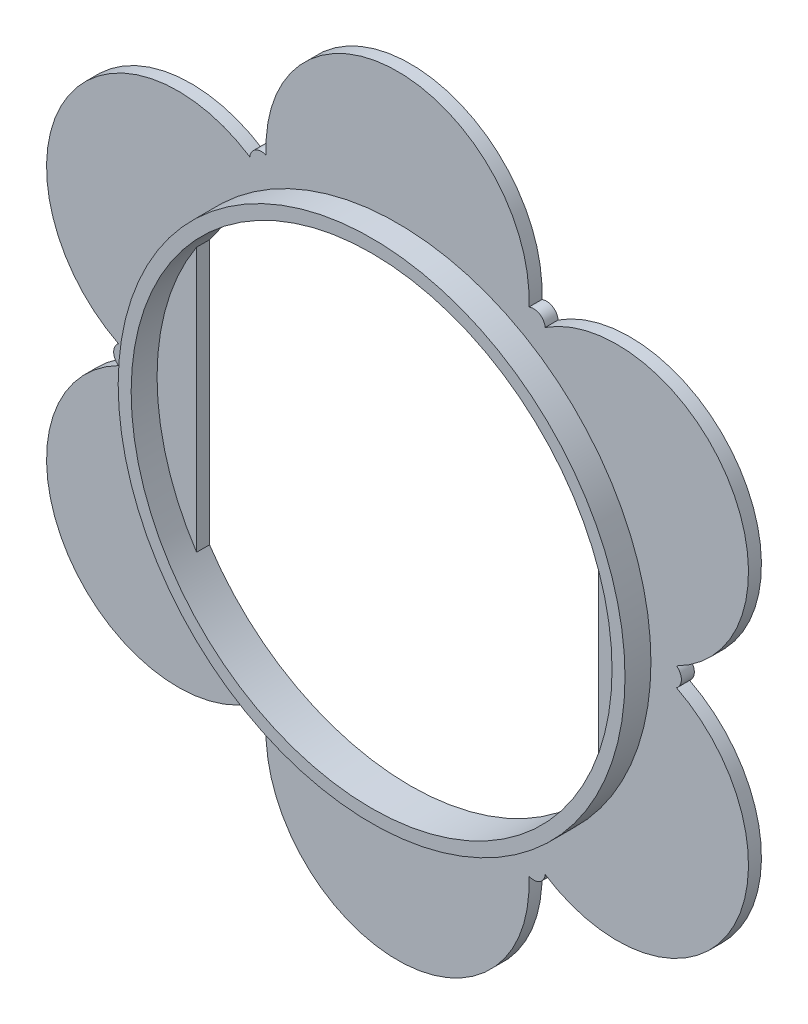
ISO-10303-21;
HEADER;
FILE_DESCRIPTION(('STEP AP214'),'2;1');
FILE_NAME('part.step','',(''),(''),'','','');
FILE_SCHEMA(('AUTOMOTIVE_DESIGN { 1 0 10303 214 1 1 1 1 }'));
ENDSEC;
DATA;
#1=APPLICATION_CONTEXT('core data for automotive mechanical design processes');
#2=APPLICATION_PROTOCOL_DEFINITION('international standard','automotive_design',2000,#1);
#3=PRODUCT_CONTEXT('',#1,'mechanical');
#4=PRODUCT('Part','Part','',(#3));
#5=PRODUCT_RELATED_PRODUCT_CATEGORY('part','',(#4));
#6=PRODUCT_DEFINITION_FORMATION('','',#4);
#7=PRODUCT_DEFINITION_CONTEXT('part definition',#1,'design');
#8=PRODUCT_DEFINITION('design','',#6,#7);
#9=PRODUCT_DEFINITION_SHAPE('','',#8);
#10=(LENGTH_UNIT() NAMED_UNIT(*) SI_UNIT(.MILLI.,.METRE.));
#11=(NAMED_UNIT(*) PLANE_ANGLE_UNIT() SI_UNIT($,.RADIAN.));
#12=(NAMED_UNIT(*) SI_UNIT($,.STERADIAN.) SOLID_ANGLE_UNIT());
#13=UNCERTAINTY_MEASURE_WITH_UNIT(LENGTH_MEASURE(1.E-05),#10,'distance_accuracy_value','');
#14=(GEOMETRIC_REPRESENTATION_CONTEXT(3) GLOBAL_UNCERTAINTY_ASSIGNED_CONTEXT((#13)) GLOBAL_UNIT_ASSIGNED_CONTEXT((#10,
#11,#12)) REPRESENTATION_CONTEXT('',''));
#15=CARTESIAN_POINT('',(0.,0.,0.));
#16=DIRECTION('',(0.,0.,1.));
#17=DIRECTION('',(1.,0.,0.));
#18=AXIS2_PLACEMENT_3D('',#15,#16,#17);
#19=CARTESIAN_POINT('',(-27.4296394046554,27.9595290821569,3.86907941255965));
#20=DIRECTION('',(0.,0.,1.));
#21=DIRECTION('',(1.,0.,0.));
#22=AXIS2_PLACEMENT_3D('',#19,#20,#21);
#23=PLANE('',#22);
#24=DIRECTION('',(0.,-1.,0.));
#25=VECTOR('',#24,1.);
#26=CARTESIAN_POINT('',(-31.,20.3816093574575,3.86907941255965));
#27=LINE('',#26,#25);
#28=CARTESIAN_POINT('',(-31.,20.3816093574575,3.86907941255965));
#29=VERTEX_POINT('',#28);
#30=CARTESIAN_POINT('',(-31.,-20.3816093574575,3.86907941255965));
#31=VERTEX_POINT('',#30);
#32=EDGE_CURVE('E243',#29,#31,#27,.T.);
#33=ORIENTED_EDGE('',*,*,#32,.F.);
#34=CARTESIAN_POINT('',(0.,0.,3.86907941255965));
#35=DIRECTION('',(0.,0.,1.));
#36=DIRECTION('',(1.,0.,0.));
#37=AXIS2_PLACEMENT_3D('',#34,#35,#36);
#38=CIRCLE('',#37,37.1);
#39=EDGE_CURVE('E48',#29,#31,#38,.T.);
#40=ORIENTED_EDGE('',*,*,#39,.T.);
#41=EDGE_LOOP('',(#33,#40));
#42=FACE_BOUND('',#41,.T.);
#43=ADVANCED_FACE('F39',(#42),#23,.T.);
#44=DIRECTION('',(0.,1.,0.));
#45=VECTOR('',#44,1.);
#46=CARTESIAN_POINT('',(30.9999999999999,20.3816093574575,3.86907941255965));
#47=LINE('',#46,#45);
#48=CARTESIAN_POINT('',(30.9999999999998,-20.3816093574579,3.86907941255965));
#49=VERTEX_POINT('',#48);
#50=CARTESIAN_POINT('',(30.9999999999999,20.3816093574575,3.86907941255965));
#51=VERTEX_POINT('',#50);
#52=EDGE_CURVE('E246',#49,#51,#47,.T.);
#53=ORIENTED_EDGE('',*,*,#52,.F.);
#54=EDGE_CURVE('E226',#49,#51,#38,.T.);
#55=ORIENTED_EDGE('',*,*,#54,.T.);
#56=EDGE_LOOP('',(#53,#55));
#57=FACE_BOUND('',#56,.T.);
#58=ADVANCED_FACE('F323',(#57),#23,.T.);
#59=CARTESIAN_POINT('',(0.,0.,3.86907941255965));
#60=DIRECTION('',(0.,0.,1.));
#61=DIRECTION('',(1.,0.,0.));
#62=AXIS2_PLACEMENT_3D('',#59,#60,#61);
#63=CIRCLE('',#62,39.1);
#64=CARTESIAN_POINT('',(39.1,0.,3.86907941255965));
#65=VERTEX_POINT('',#64);
#66=EDGE_CURVE('E11',#65,#65,#63,.T.);
#67=ORIENTED_EDGE('',*,*,#66,.F.);
#68=EDGE_LOOP('',(#67));
#69=FACE_BOUND('',#68,.T.);
#70=CARTESIAN_POINT('',(-20.9976855213396,36.3690581643134,3.86907941255965));
#71=DIRECTION('',(0.,0.,1.));
#72=DIRECTION('',(1.,0.,0.));
#73=AXIS2_PLACEMENT_3D('',#70,#71,#72);
#74=CIRCLE('',#73,1.80000000000002);
#75=CARTESIAN_POINT('',(-20.2604108869917,38.0111379777047,3.86907941255965));
#76=VERTEX_POINT('',#75);
#77=CARTESIAN_POINT('',(-22.7884056719519,36.5515995080985,3.86907941255965));
#78=VERTEX_POINT('',#77);
#79=EDGE_CURVE('E205',#76,#78,#74,.T.);
#80=ORIENTED_EDGE('',*,*,#79,.T.);
#81=CARTESIAN_POINT('',(-33.8615932879713,19.5500000000004,3.86907941255965));
#82=DIRECTION('',(0.,0.,1.));
#83=DIRECTION('',(1.,0.,0.));
#84=AXIS2_PLACEMENT_3D('',#81,#82,#83);
#85=CIRCLE('',#84,20.2896493270172);
#86=CARTESIAN_POINT('',(-43.0488165589436,1.45953846960726,3.86907941255965));
#87=VERTEX_POINT('',#86);
#88=EDGE_CURVE('E118',#78,#87,#85,.T.);
#89=ORIENTED_EDGE('',*,*,#88,.T.);
#90=CARTESIAN_POINT('',(-41.995371042679,4.33680868994202E-13,3.86907941255965));
#91=DIRECTION('',(0.,0.,1.));
#92=DIRECTION('',(1.,0.,0.));
#93=AXIS2_PLACEMENT_3D('',#90,#91,#92);
#94=CIRCLE('',#93,1.80000000000002);
#95=CARTESIAN_POINT('',(-43.0488165589436,-1.45953846960634,3.86907941255965));
#96=VERTEX_POINT('',#95);
#97=EDGE_CURVE('E268',#87,#96,#94,.T.);
#98=ORIENTED_EDGE('',*,*,#97,.T.);
#99=CARTESIAN_POINT('',(-33.8615932879717,-19.5499999999997,3.86907941255965));
#100=DIRECTION('',(0.,0.,1.));
#101=DIRECTION('',(1.,0.,0.));
#102=AXIS2_PLACEMENT_3D('',#99,#100,#101);
#103=CIRCLE('',#102,20.2896493270172);
#104=CARTESIAN_POINT('',(-22.7884056719522,-36.5515995080978,3.86907941255965));
#105=VERTEX_POINT('',#104);
#106=EDGE_CURVE('E272',#96,#105,#103,.T.);
#107=ORIENTED_EDGE('',*,*,#106,.T.);
#108=CARTESIAN_POINT('',(-20.9976855213398,-36.3690581643133,3.86907941255965));
#109=DIRECTION('',(0.,0.,1.));
#110=DIRECTION('',(1.,0.,0.));
#111=AXIS2_PLACEMENT_3D('',#108,#109,#110);
#112=CIRCLE('',#111,1.80000000000002);
#113=CARTESIAN_POINT('',(-20.2604108869917,-38.0111379777045,3.86907941255965));
#114=VERTEX_POINT('',#113);
#115=EDGE_CURVE('E271',#105,#114,#112,.T.);
#116=ORIENTED_EDGE('',*,*,#115,.T.);
#117=CARTESIAN_POINT('',(0.,-39.1,3.86907941255965));
#118=DIRECTION('',(0.,0.,1.));
#119=DIRECTION('',(1.,0.,0.));
#120=AXIS2_PLACEMENT_3D('',#117,#118,#119);
#121=CIRCLE('',#120,20.2896493270172);
#122=CARTESIAN_POINT('',(20.2604108869917,-38.0111379777047,3.86907941255965));
#123=VERTEX_POINT('',#122);
#124=EDGE_CURVE('E273',#114,#123,#121,.T.);
#125=ORIENTED_EDGE('',*,*,#124,.T.);
#126=CARTESIAN_POINT('',(20.9976855213396,-36.3690581643134,3.86907941255965));
#127=DIRECTION('',(0.,0.,1.));
#128=DIRECTION('',(1.,0.,0.));
#129=AXIS2_PLACEMENT_3D('',#126,#127,#128);
#130=CIRCLE('',#129,1.80000000000002);
#131=CARTESIAN_POINT('',(22.7884056719519,-36.5515995080982,3.86907941255965));
#132=VERTEX_POINT('',#131);
#133=EDGE_CURVE('E276',#123,#132,#130,.T.);
#134=ORIENTED_EDGE('',*,*,#133,.T.);
#135=CARTESIAN_POINT('',(33.8615932879715,-19.5500000000002,3.86907941255965));
#136=DIRECTION('',(0.,0.,1.));
#137=DIRECTION('',(1.,0.,0.));
#138=AXIS2_PLACEMENT_3D('',#135,#136,#137);
#139=CIRCLE('',#138,20.2896493270172);
#140=CARTESIAN_POINT('',(43.0488165589436,-1.45953846960694,3.86907941255965));
#141=VERTEX_POINT('',#140);
#142=EDGE_CURVE('E278',#132,#141,#139,.T.);
#143=ORIENTED_EDGE('',*,*,#142,.T.);
#144=CARTESIAN_POINT('',(41.995371042679,-1.35308431126191E-13,3.86907941255965));
#145=DIRECTION('',(0.,0.,1.));
#146=DIRECTION('',(1.,0.,0.));
#147=AXIS2_PLACEMENT_3D('',#144,#145,#146);
#148=CIRCLE('',#147,1.80000000000001);
#149=CARTESIAN_POINT('',(43.0488165589436,1.45953846960665,3.86907941255965));
#150=VERTEX_POINT('',#149);
#151=EDGE_CURVE('E152',#141,#150,#148,.T.);
#152=ORIENTED_EDGE('',*,*,#151,.T.);
#153=CARTESIAN_POINT('',(33.8615932879716,19.5499999999999,3.86907941255965));
#154=DIRECTION('',(0.,0.,1.));
#155=DIRECTION('',(1.,0.,0.));
#156=AXIS2_PLACEMENT_3D('',#153,#154,#155);
#157=CIRCLE('',#156,20.2896493270172);
#158=CARTESIAN_POINT('',(22.788405671952,36.5515995080979,3.86907941255965));
#159=VERTEX_POINT('',#158);
#160=EDGE_CURVE('E146',#150,#159,#157,.T.);
#161=ORIENTED_EDGE('',*,*,#160,.T.);
#162=CARTESIAN_POINT('',(20.9976855213395,36.3690581643134,3.86907941255965));
#163=DIRECTION('',(0.,0.,1.));
#164=DIRECTION('',(1.,0.,0.));
#165=AXIS2_PLACEMENT_3D('',#162,#163,#164);
#166=CIRCLE('',#165,1.80000000000001);
#167=CARTESIAN_POINT('',(20.2604108869917,38.0111379777047,3.86907941255965));
#168=VERTEX_POINT('',#167);
#169=EDGE_CURVE('E151',#159,#168,#166,.T.);
#170=ORIENTED_EDGE('',*,*,#169,.T.);
#171=CARTESIAN_POINT('',(0.,39.1,3.86907941255965));
#172=DIRECTION('',(0.,0.,1.));
#173=DIRECTION('',(1.,0.,0.));
#174=AXIS2_PLACEMENT_3D('',#171,#172,#173);
#175=CIRCLE('',#174,20.2896493270172);
#176=EDGE_CURVE('E62',#168,#76,#175,.T.);
#177=ORIENTED_EDGE('',*,*,#176,.T.);
#178=EDGE_LOOP('',(#80,#89,#98,#107,#116,#125,#134,#143,#152,#161,#170,#177));
#179=FACE_BOUND('',#178,.T.);
#180=ADVANCED_FACE('F148',(#69,#179),#23,.T.);
#181=CARTESIAN_POINT('',(-27.4296394046554,27.9595290821569,1.86907941255965));
#182=DIRECTION('',(0.,0.,1.));
#183=DIRECTION('',(1.,0.,0.));
#184=AXIS2_PLACEMENT_3D('',#181,#182,#183);
#185=PLANE('',#184);
#186=CARTESIAN_POINT('',(-20.9976855213396,36.3690581643134,1.86907941255965));
#187=DIRECTION('',(0.,0.,1.));
#188=DIRECTION('',(1.,0.,0.));
#189=AXIS2_PLACEMENT_3D('',#186,#187,#188);
#190=CIRCLE('',#189,1.80000000000002);
#191=CARTESIAN_POINT('',(-20.2604108869917,38.0111379777047,1.86907941255965));
#192=VERTEX_POINT('',#191);
#193=CARTESIAN_POINT('',(-22.7884056719519,36.5515995080985,1.86907941255965));
#194=VERTEX_POINT('',#193);
#195=EDGE_CURVE('E174',#192,#194,#190,.T.);
#196=ORIENTED_EDGE('',*,*,#195,.F.);
#197=CARTESIAN_POINT('',(0.,39.1,1.86907941255965));
#198=DIRECTION('',(0.,0.,1.));
#199=DIRECTION('',(1.,0.,0.));
#200=AXIS2_PLACEMENT_3D('',#197,#198,#199);
#201=CIRCLE('',#200,20.2896493270172);
#202=CARTESIAN_POINT('',(20.2604108869917,38.0111379777047,1.86907941255965));
#203=VERTEX_POINT('',#202);
#204=EDGE_CURVE('E109',#203,#192,#201,.T.);
#205=ORIENTED_EDGE('',*,*,#204,.F.);
#206=CARTESIAN_POINT('',(20.9976855213395,36.3690581643134,1.86907941255965));
#207=DIRECTION('',(0.,0.,1.));
#208=DIRECTION('',(1.,0.,0.));
#209=AXIS2_PLACEMENT_3D('',#206,#207,#208);
#210=CIRCLE('',#209,1.80000000000001);
#211=CARTESIAN_POINT('',(22.788405671952,36.5515995080979,1.86907941255965));
#212=VERTEX_POINT('',#211);
#213=EDGE_CURVE('E199',#212,#203,#210,.T.);
#214=ORIENTED_EDGE('',*,*,#213,.F.);
#215=CARTESIAN_POINT('',(33.8615932879716,19.5499999999999,1.86907941255965));
#216=DIRECTION('',(0.,0.,1.));
#217=DIRECTION('',(1.,0.,0.));
#218=AXIS2_PLACEMENT_3D('',#215,#216,#217);
#219=CIRCLE('',#218,20.2896493270172);
#220=CARTESIAN_POINT('',(43.0488165589436,1.45953846960665,1.86907941255965));
#221=VERTEX_POINT('',#220);
#222=EDGE_CURVE('E165',#221,#212,#219,.T.);
#223=ORIENTED_EDGE('',*,*,#222,.F.);
#224=CARTESIAN_POINT('',(41.995371042679,-1.35308431126191E-13,1.86907941255965));
#225=DIRECTION('',(0.,0.,1.));
#226=DIRECTION('',(1.,0.,0.));
#227=AXIS2_PLACEMENT_3D('',#224,#225,#226);
#228=CIRCLE('',#227,1.80000000000001);
#229=CARTESIAN_POINT('',(43.0488165589436,-1.45953846960694,1.86907941255965));
#230=VERTEX_POINT('',#229);
#231=EDGE_CURVE('E200',#230,#221,#228,.T.);
#232=ORIENTED_EDGE('',*,*,#231,.F.);
#233=CARTESIAN_POINT('',(33.8615932879715,-19.5500000000002,1.86907941255965));
#234=DIRECTION('',(0.,0.,1.));
#235=DIRECTION('',(1.,0.,0.));
#236=AXIS2_PLACEMENT_3D('',#233,#234,#235);
#237=CIRCLE('',#236,20.2896493270172);
#238=CARTESIAN_POINT('',(22.7884056719519,-36.5515995080982,1.86907941255965));
#239=VERTEX_POINT('',#238);
#240=EDGE_CURVE('E193',#239,#230,#237,.T.);
#241=ORIENTED_EDGE('',*,*,#240,.F.);
#242=CARTESIAN_POINT('',(20.9976855213396,-36.3690581643134,1.86907941255965));
#243=DIRECTION('',(0.,0.,1.));
#244=DIRECTION('',(1.,0.,0.));
#245=AXIS2_PLACEMENT_3D('',#242,#243,#244);
#246=CIRCLE('',#245,1.8);
#247=CARTESIAN_POINT('',(20.2604108869917,-38.0111379777047,1.86907941255965));
#248=VERTEX_POINT('',#247);
#249=EDGE_CURVE('E191',#248,#239,#246,.T.);
#250=ORIENTED_EDGE('',*,*,#249,.F.);
#251=CARTESIAN_POINT('',(0.,-39.1,1.86907941255965));
#252=DIRECTION('',(0.,0.,1.));
#253=DIRECTION('',(1.,0.,0.));
#254=AXIS2_PLACEMENT_3D('',#251,#252,#253);
#255=CIRCLE('',#254,20.2896493270172);
#256=CARTESIAN_POINT('',(-20.2604108869917,-38.0111379777045,1.86907941255965));
#257=VERTEX_POINT('',#256);
#258=EDGE_CURVE('E186',#257,#248,#255,.T.);
#259=ORIENTED_EDGE('',*,*,#258,.F.);
#260=CARTESIAN_POINT('',(-20.9976855213398,-36.3690581643133,1.86907941255965));
#261=DIRECTION('',(0.,0.,1.));
#262=DIRECTION('',(1.,0.,0.));
#263=AXIS2_PLACEMENT_3D('',#260,#261,#262);
#264=CIRCLE('',#263,1.80000000000001);
#265=CARTESIAN_POINT('',(-22.7884056719522,-36.5515995080978,1.86907941255965));
#266=VERTEX_POINT('',#265);
#267=EDGE_CURVE('E190',#266,#257,#264,.T.);
#268=ORIENTED_EDGE('',*,*,#267,.F.);
#269=CARTESIAN_POINT('',(-33.8615932879717,-19.5499999999997,1.86907941255965));
#270=DIRECTION('',(0.,0.,1.));
#271=DIRECTION('',(1.,0.,0.));
#272=AXIS2_PLACEMENT_3D('',#269,#270,#271);
#273=CIRCLE('',#272,20.2896493270172);
#274=CARTESIAN_POINT('',(-43.0488165589436,-1.45953846960634,1.86907941255965));
#275=VERTEX_POINT('',#274);
#276=EDGE_CURVE('E183',#275,#266,#273,.T.);
#277=ORIENTED_EDGE('',*,*,#276,.F.);
#278=CARTESIAN_POINT('',(-41.995371042679,4.33680868994202E-13,1.86907941255965));
#279=DIRECTION('',(0.,0.,1.));
#280=DIRECTION('',(1.,0.,0.));
#281=AXIS2_PLACEMENT_3D('',#278,#279,#280);
#282=CIRCLE('',#281,1.80000000000001);
#283=CARTESIAN_POINT('',(-43.0488165589436,1.45953846960726,1.86907941255965));
#284=VERTEX_POINT('',#283);
#285=EDGE_CURVE('E185',#284,#275,#282,.T.);
#286=ORIENTED_EDGE('',*,*,#285,.F.);
#287=CARTESIAN_POINT('',(-33.8615932879713,19.5500000000004,1.86907941255965));
#288=DIRECTION('',(0.,0.,1.));
#289=DIRECTION('',(1.,0.,0.));
#290=AXIS2_PLACEMENT_3D('',#287,#288,#289);
#291=CIRCLE('',#290,20.2896493270172);
#292=EDGE_CURVE('E178',#194,#284,#291,.T.);
#293=ORIENTED_EDGE('',*,*,#292,.F.);
#294=EDGE_LOOP('',(#196,#205,#214,#223,#232,#241,#250,#259,#268,#277,#286,#293));
#295=FACE_BOUND('',#294,.T.);
#296=CARTESIAN_POINT('',(0.,0.,1.86907941255965));
#297=DIRECTION('',(0.,0.,1.));
#298=DIRECTION('',(1.,0.,0.));
#299=AXIS2_PLACEMENT_3D('',#296,#297,#298);
#300=CIRCLE('',#299,37.0999999999999);
#301=CARTESIAN_POINT('',(30.9999999999999,20.3816093574575,1.86907941255965));
#302=VERTEX_POINT('',#301);
#303=CARTESIAN_POINT('',(-31.,20.3816093574575,1.86907941255965));
#304=VERTEX_POINT('',#303);
#305=EDGE_CURVE('E57',#302,#304,#300,.T.);
#306=ORIENTED_EDGE('',*,*,#305,.T.);
#307=DIRECTION('',(0.,-1.,0.));
#308=VECTOR('',#307,1.);
#309=CARTESIAN_POINT('',(-31.,20.3816093574575,1.86907941255965));
#310=LINE('',#309,#308);
#311=CARTESIAN_POINT('',(-30.9999999999999,-20.3816093574575,1.86907941255965));
#312=VERTEX_POINT('',#311);
#313=EDGE_CURVE('E252',#304,#312,#310,.T.);
#314=ORIENTED_EDGE('',*,*,#313,.T.);
#315=CARTESIAN_POINT('',(0.,0.,1.86907941255965));
#316=DIRECTION('',(0.,0.,1.));
#317=DIRECTION('',(1.,0.,0.));
#318=AXIS2_PLACEMENT_3D('',#315,#316,#317);
#319=CIRCLE('',#318,37.0999999999999);
#320=CARTESIAN_POINT('',(30.9999999999998,-20.3816093574576,1.86907941255965));
#321=VERTEX_POINT('',#320);
#322=EDGE_CURVE('E251',#312,#321,#319,.T.);
#323=ORIENTED_EDGE('',*,*,#322,.T.);
#324=DIRECTION('',(0.,1.,0.));
#325=VECTOR('',#324,1.);
#326=CARTESIAN_POINT('',(30.9999999999999,20.3816093574575,1.86907941255965));
#327=LINE('',#326,#325);
#328=EDGE_CURVE('E250',#321,#302,#327,.T.);
#329=ORIENTED_EDGE('',*,*,#328,.T.);
#330=EDGE_LOOP('',(#306,#314,#323,#329));
#331=FACE_BOUND('',#330,.T.);
#332=ADVANCED_FACE('F293',(#295,#331),#185,.F.);
#333=CARTESIAN_POINT('',(-20.9976855213396,36.3690581643134,3.86907941255965));
#334=DIRECTION('',(0.,0.,-1.));
#335=DIRECTION('',(-1.,0.,0.));
#336=AXIS2_PLACEMENT_3D('',#333,#334,#335);
#337=CYLINDRICAL_SURFACE('',#336,1.80000000000002);
#338=ORIENTED_EDGE('',*,*,#195,.T.);
#339=DIRECTION('',(0.,0.,-1.));
#340=VECTOR('',#339,1.);
#341=CARTESIAN_POINT('',(-22.7884056719519,36.5515995080985,3.86907941255965));
#342=LINE('',#341,#340);
#343=EDGE_CURVE('E43',#78,#194,#342,.T.);
#344=ORIENTED_EDGE('',*,*,#343,.F.);
#345=ORIENTED_EDGE('',*,*,#79,.F.);
#346=DIRECTION('',(0.,0.,-1.));
#347=VECTOR('',#346,1.);
#348=CARTESIAN_POINT('',(-20.2604108869917,38.0111379777047,3.86907941255965));
#349=LINE('',#348,#347);
#350=EDGE_CURVE('E171',#76,#192,#349,.T.);
#351=ORIENTED_EDGE('',*,*,#350,.T.);
#352=EDGE_LOOP('',(#338,#344,#345,#351));
#353=FACE_BOUND('',#352,.T.);
#354=ADVANCED_FACE('F41',(#353),#337,.T.);
#355=CARTESIAN_POINT('',(-33.8615932879713,19.5500000000004,3.86907941255965));
#356=DIRECTION('',(0.,0.,-1.));
#357=DIRECTION('',(-1.,0.,0.));
#358=AXIS2_PLACEMENT_3D('',#355,#356,#357);
#359=CYLINDRICAL_SURFACE('',#358,20.2896493270172);
#360=ORIENTED_EDGE('',*,*,#292,.T.);
#361=DIRECTION('',(0.,0.,-1.));
#362=VECTOR('',#361,1.);
#363=CARTESIAN_POINT('',(-43.0488165589436,1.45953846960726,3.86907941255965));
#364=LINE('',#363,#362);
#365=EDGE_CURVE('E223',#87,#284,#364,.T.);
#366=ORIENTED_EDGE('',*,*,#365,.F.);
#367=ORIENTED_EDGE('',*,*,#88,.F.);
#368=ORIENTED_EDGE('',*,*,#343,.T.);
#369=EDGE_LOOP('',(#360,#366,#367,#368));
#370=FACE_BOUND('',#369,.T.);
#371=ADVANCED_FACE('F300',(#370),#359,.T.);
#372=CARTESIAN_POINT('',(-41.995371042679,4.33680868994202E-13,3.86907941255965));
#373=DIRECTION('',(0.,0.,-1.));
#374=DIRECTION('',(-1.,0.,0.));
#375=AXIS2_PLACEMENT_3D('',#372,#373,#374);
#376=CYLINDRICAL_SURFACE('',#375,1.80000000000001);
#377=ORIENTED_EDGE('',*,*,#285,.T.);
#378=DIRECTION('',(0.,0.,-1.));
#379=VECTOR('',#378,1.);
#380=CARTESIAN_POINT('',(-43.0488165589436,-1.45953846960634,3.86907941255965));
#381=LINE('',#380,#379);
#382=EDGE_CURVE('E221',#96,#275,#381,.T.);
#383=ORIENTED_EDGE('',*,*,#382,.F.);
#384=ORIENTED_EDGE('',*,*,#97,.F.);
#385=ORIENTED_EDGE('',*,*,#365,.T.);
#386=EDGE_LOOP('',(#377,#383,#384,#385));
#387=FACE_BOUND('',#386,.T.);
#388=ADVANCED_FACE('F296',(#387),#376,.T.);
#389=CARTESIAN_POINT('',(-33.8615932879717,-19.5499999999997,3.86907941255965));
#390=DIRECTION('',(0.,0.,-1.));
#391=DIRECTION('',(-1.,0.,0.));
#392=AXIS2_PLACEMENT_3D('',#389,#390,#391);
#393=CYLINDRICAL_SURFACE('',#392,20.2896493270172);
#394=ORIENTED_EDGE('',*,*,#276,.T.);
#395=DIRECTION('',(0.,0.,-1.));
#396=VECTOR('',#395,1.);
#397=CARTESIAN_POINT('',(-22.7884056719522,-36.5515995080978,3.86907941255965));
#398=LINE('',#397,#396);
#399=EDGE_CURVE('E217',#105,#266,#398,.T.);
#400=ORIENTED_EDGE('',*,*,#399,.F.);
#401=ORIENTED_EDGE('',*,*,#106,.F.);
#402=ORIENTED_EDGE('',*,*,#382,.T.);
#403=EDGE_LOOP('',(#394,#400,#401,#402));
#404=FACE_BOUND('',#403,.T.);
#405=ADVANCED_FACE('F303',(#404),#393,.T.);
#406=CARTESIAN_POINT('',(-20.9976855213398,-36.3690581643133,3.86907941255965));
#407=DIRECTION('',(0.,0.,-1.));
#408=DIRECTION('',(-1.,0.,0.));
#409=AXIS2_PLACEMENT_3D('',#406,#407,#408);
#410=CYLINDRICAL_SURFACE('',#409,1.80000000000001);
#411=ORIENTED_EDGE('',*,*,#267,.T.);
#412=DIRECTION('',(0.,0.,-1.));
#413=VECTOR('',#412,1.);
#414=CARTESIAN_POINT('',(-20.2604108869917,-38.0111379777045,3.86907941255965));
#415=LINE('',#414,#413);
#416=EDGE_CURVE('E216',#114,#257,#415,.T.);
#417=ORIENTED_EDGE('',*,*,#416,.F.);
#418=ORIENTED_EDGE('',*,*,#115,.F.);
#419=ORIENTED_EDGE('',*,*,#399,.T.);
#420=EDGE_LOOP('',(#411,#417,#418,#419));
#421=FACE_BOUND('',#420,.T.);
#422=ADVANCED_FACE('F307',(#421),#410,.T.);
#423=CARTESIAN_POINT('',(0.,-39.1,3.86907941255965));
#424=DIRECTION('',(0.,0.,-1.));
#425=DIRECTION('',(-1.,0.,0.));
#426=AXIS2_PLACEMENT_3D('',#423,#424,#425);
#427=CYLINDRICAL_SURFACE('',#426,20.2896493270172);
#428=ORIENTED_EDGE('',*,*,#258,.T.);
#429=DIRECTION('',(0.,0.,-1.));
#430=VECTOR('',#429,1.);
#431=CARTESIAN_POINT('',(20.2604108869917,-38.0111379777047,3.86907941255965));
#432=LINE('',#431,#430);
#433=EDGE_CURVE('E215',#123,#248,#432,.T.);
#434=ORIENTED_EDGE('',*,*,#433,.F.);
#435=ORIENTED_EDGE('',*,*,#124,.F.);
#436=ORIENTED_EDGE('',*,*,#416,.T.);
#437=EDGE_LOOP('',(#428,#434,#435,#436));
#438=FACE_BOUND('',#437,.T.);
#439=ADVANCED_FACE('F315',(#438),#427,.T.);
#440=CARTESIAN_POINT('',(20.9976855213396,-36.3690581643134,3.86907941255965));
#441=DIRECTION('',(0.,0.,-1.));
#442=DIRECTION('',(-1.,0.,0.));
#443=AXIS2_PLACEMENT_3D('',#440,#441,#442);
#444=CYLINDRICAL_SURFACE('',#443,1.8);
#445=ORIENTED_EDGE('',*,*,#249,.T.);
#446=DIRECTION('',(0.,0.,-1.));
#447=VECTOR('',#446,1.);
#448=CARTESIAN_POINT('',(22.7884056719519,-36.5515995080982,3.86907941255965));
#449=LINE('',#448,#447);
#450=EDGE_CURVE('E208',#132,#239,#449,.T.);
#451=ORIENTED_EDGE('',*,*,#450,.F.);
#452=ORIENTED_EDGE('',*,*,#133,.F.);
#453=ORIENTED_EDGE('',*,*,#433,.T.);
#454=EDGE_LOOP('',(#445,#451,#452,#453));
#455=FACE_BOUND('',#454,.T.);
#456=ADVANCED_FACE('F313',(#455),#444,.T.);
#457=CARTESIAN_POINT('',(33.8615932879715,-19.5500000000002,3.86907941255965));
#458=DIRECTION('',(0.,0.,-1.));
#459=DIRECTION('',(-1.,0.,0.));
#460=AXIS2_PLACEMENT_3D('',#457,#458,#459);
#461=CYLINDRICAL_SURFACE('',#460,20.2896493270172);
#462=ORIENTED_EDGE('',*,*,#240,.T.);
#463=DIRECTION('',(0.,0.,-1.));
#464=VECTOR('',#463,1.);
#465=CARTESIAN_POINT('',(43.0488165589436,-1.45953846960694,3.86907941255965));
#466=LINE('',#465,#464);
#467=EDGE_CURVE('E210',#141,#230,#466,.T.);
#468=ORIENTED_EDGE('',*,*,#467,.F.);
#469=ORIENTED_EDGE('',*,*,#142,.F.);
#470=ORIENTED_EDGE('',*,*,#450,.T.);
#471=EDGE_LOOP('',(#462,#468,#469,#470));
#472=FACE_BOUND('',#471,.T.);
#473=ADVANCED_FACE('F284',(#472),#461,.T.);
#474=CARTESIAN_POINT('',(41.995371042679,-1.35308431126191E-13,3.86907941255965));
#475=DIRECTION('',(0.,0.,-1.));
#476=DIRECTION('',(-1.,0.,0.));
#477=AXIS2_PLACEMENT_3D('',#474,#475,#476);
#478=CYLINDRICAL_SURFACE('',#477,1.80000000000001);
#479=ORIENTED_EDGE('',*,*,#231,.T.);
#480=DIRECTION('',(0.,0.,-1.));
#481=VECTOR('',#480,1.);
#482=CARTESIAN_POINT('',(43.0488165589436,1.45953846960665,3.86907941255965));
#483=LINE('',#482,#481);
#484=EDGE_CURVE('E168',#150,#221,#483,.T.);
#485=ORIENTED_EDGE('',*,*,#484,.F.);
#486=ORIENTED_EDGE('',*,*,#151,.F.);
#487=ORIENTED_EDGE('',*,*,#467,.T.);
#488=EDGE_LOOP('',(#479,#485,#486,#487));
#489=FACE_BOUND('',#488,.T.);
#490=ADVANCED_FACE('F290',(#489),#478,.T.);
#491=CARTESIAN_POINT('',(33.8615932879716,19.5499999999999,3.86907941255965));
#492=DIRECTION('',(0.,0.,-1.));
#493=DIRECTION('',(-1.,0.,0.));
#494=AXIS2_PLACEMENT_3D('',#491,#492,#493);
#495=CYLINDRICAL_SURFACE('',#494,20.2896493270172);
#496=ORIENTED_EDGE('',*,*,#222,.T.);
#497=DIRECTION('',(0.,0.,-1.));
#498=VECTOR('',#497,1.);
#499=CARTESIAN_POINT('',(22.788405671952,36.5515995080979,3.86907941255965));
#500=LINE('',#499,#498);
#501=EDGE_CURVE('E163',#159,#212,#500,.T.);
#502=ORIENTED_EDGE('',*,*,#501,.F.);
#503=ORIENTED_EDGE('',*,*,#160,.F.);
#504=ORIENTED_EDGE('',*,*,#484,.T.);
#505=EDGE_LOOP('',(#496,#502,#503,#504));
#506=FACE_BOUND('',#505,.T.);
#507=ADVANCED_FACE('F162',(#506),#495,.T.);
#508=CARTESIAN_POINT('',(20.9976855213395,36.3690581643134,3.86907941255965));
#509=DIRECTION('',(0.,0.,-1.));
#510=DIRECTION('',(-1.,0.,0.));
#511=AXIS2_PLACEMENT_3D('',#508,#509,#510);
#512=CYLINDRICAL_SURFACE('',#511,1.80000000000001);
#513=ORIENTED_EDGE('',*,*,#213,.T.);
#514=DIRECTION('',(0.,0.,-1.));
#515=VECTOR('',#514,1.);
#516=CARTESIAN_POINT('',(20.2604108869917,38.0111379777047,3.86907941255965));
#517=LINE('',#516,#515);
#518=EDGE_CURVE('E170',#168,#203,#517,.T.);
#519=ORIENTED_EDGE('',*,*,#518,.F.);
#520=ORIENTED_EDGE('',*,*,#169,.F.);
#521=ORIENTED_EDGE('',*,*,#501,.T.);
#522=EDGE_LOOP('',(#513,#519,#520,#521));
#523=FACE_BOUND('',#522,.T.);
#524=ADVANCED_FACE('F169',(#523),#512,.T.);
#525=CARTESIAN_POINT('',(0.,39.1,3.86907941255965));
#526=DIRECTION('',(0.,0.,-1.));
#527=DIRECTION('',(-1.,0.,0.));
#528=AXIS2_PLACEMENT_3D('',#525,#526,#527);
#529=CYLINDRICAL_SURFACE('',#528,20.2896493270172);
#530=ORIENTED_EDGE('',*,*,#204,.T.);
#531=ORIENTED_EDGE('',*,*,#350,.F.);
#532=ORIENTED_EDGE('',*,*,#176,.F.);
#533=ORIENTED_EDGE('',*,*,#518,.T.);
#534=EDGE_LOOP('',(#530,#531,#532,#533));
#535=FACE_BOUND('',#534,.T.);
#536=ADVANCED_FACE('F291',(#535),#529,.T.);
#537=CARTESIAN_POINT('',(0.,0.,3.86907941255965));
#538=DIRECTION('',(0.,0.,-1.));
#539=DIRECTION('',(-1.,0.,0.));
#540=AXIS2_PLACEMENT_3D('',#537,#538,#539);
#541=CYLINDRICAL_SURFACE('',#540,37.0999999999999);
#542=ORIENTED_EDGE('',*,*,#305,.F.);
#543=DIRECTION('',(0.,0.,-1.));
#544=VECTOR('',#543,1.);
#545=CARTESIAN_POINT('',(30.9999999999999,20.3816093574575,3.86907941255965));
#546=LINE('',#545,#544);
#547=EDGE_CURVE('E248',#51,#302,#546,.T.);
#548=ORIENTED_EDGE('',*,*,#547,.F.);
#549=ORIENTED_EDGE('',*,*,#54,.F.);
#550=DIRECTION('',(0.,0.,-1.));
#551=VECTOR('',#550,1.);
#552=CARTESIAN_POINT('',(30.9999999999998,-20.3816093574576,3.86907941255965));
#553=LINE('',#552,#551);
#554=EDGE_CURVE('E257',#49,#321,#553,.T.);
#555=ORIENTED_EDGE('',*,*,#554,.T.);
#556=ORIENTED_EDGE('',*,*,#322,.F.);
#557=DIRECTION('',(0.,0.,-1.));
#558=VECTOR('',#557,1.);
#559=CARTESIAN_POINT('',(-30.9999999999999,-20.3816093574575,3.86907941255965));
#560=LINE('',#559,#558);
#561=EDGE_CURVE('E263',#31,#312,#560,.T.);
#562=ORIENTED_EDGE('',*,*,#561,.F.);
#563=ORIENTED_EDGE('',*,*,#39,.F.);
#564=DIRECTION('',(0.,0.,-1.));
#565=VECTOR('',#564,1.);
#566=CARTESIAN_POINT('',(-31.,20.3816093574575,3.86907941255965));
#567=LINE('',#566,#565);
#568=EDGE_CURVE('E177',#29,#304,#567,.T.);
#569=ORIENTED_EDGE('',*,*,#568,.T.);
#570=EDGE_LOOP('',(#542,#548,#549,#555,#556,#562,#563,#569));
#571=FACE_BOUND('',#570,.T.);
#572=CARTESIAN_POINT('',(0.,0.,7.86907941255965));
#573=DIRECTION('',(0.,0.,1.));
#574=DIRECTION('',(1.,0.,0.));
#575=AXIS2_PLACEMENT_3D('',#572,#573,#574);
#576=CIRCLE('',#575,37.1);
#577=CARTESIAN_POINT('',(37.1,0.,7.86907941255965));
#578=VERTEX_POINT('',#577);
#579=EDGE_CURVE('E237',#578,#578,#576,.T.);
#580=ORIENTED_EDGE('',*,*,#579,.T.);
#581=EDGE_LOOP('',(#580));
#582=FACE_BOUND('',#581,.T.);
#583=ADVANCED_FACE('F359',(#571,#582),#541,.F.);
#584=CARTESIAN_POINT('',(-31.,20.3816093574575,3.86907941255965));
#585=DIRECTION('',(1.,0.,0.));
#586=DIRECTION('',(0.,0.,-1.));
#587=AXIS2_PLACEMENT_3D('',#584,#585,#586);
#588=PLANE('',#587);
#589=ORIENTED_EDGE('',*,*,#313,.F.);
#590=ORIENTED_EDGE('',*,*,#568,.F.);
#591=ORIENTED_EDGE('',*,*,#32,.T.);
#592=ORIENTED_EDGE('',*,*,#561,.T.);
#593=EDGE_LOOP('',(#589,#590,#591,#592));
#594=FACE_BOUND('',#593,.T.);
#595=ADVANCED_FACE('F357',(#594),#588,.T.);
#596=CARTESIAN_POINT('',(30.9999999999999,20.3816093574575,3.86907941255965));
#597=DIRECTION('',(-1.,0.,0.));
#598=DIRECTION('',(0.,-1.,0.));
#599=AXIS2_PLACEMENT_3D('',#596,#597,#598);
#600=PLANE('',#599);
#601=ORIENTED_EDGE('',*,*,#328,.F.);
#602=ORIENTED_EDGE('',*,*,#554,.F.);
#603=ORIENTED_EDGE('',*,*,#52,.T.);
#604=ORIENTED_EDGE('',*,*,#547,.T.);
#605=EDGE_LOOP('',(#601,#602,#603,#604));
#606=FACE_BOUND('',#605,.T.);
#607=ADVANCED_FACE('F349',(#606),#600,.T.);
#608=CARTESIAN_POINT('',(0.,0.,7.86907941255965));
#609=DIRECTION('',(0.,0.,1.));
#610=DIRECTION('',(1.,0.,0.));
#611=AXIS2_PLACEMENT_3D('',#608,#609,#610);
#612=PLANE('',#611);
#613=CARTESIAN_POINT('',(0.,0.,7.86907941255965));
#614=DIRECTION('',(0.,0.,1.));
#615=DIRECTION('',(1.,0.,0.));
#616=AXIS2_PLACEMENT_3D('',#613,#614,#615);
#617=CIRCLE('',#616,39.1);
#618=CARTESIAN_POINT('',(39.1,0.,7.86907941255965));
#619=VERTEX_POINT('',#618);
#620=EDGE_CURVE('E239',#619,#619,#617,.T.);
#621=ORIENTED_EDGE('',*,*,#620,.T.);
#622=EDGE_LOOP('',(#621));
#623=FACE_BOUND('',#622,.T.);
#624=ORIENTED_EDGE('',*,*,#579,.F.);
#625=EDGE_LOOP('',(#624));
#626=FACE_BOUND('',#625,.T.);
#627=ADVANCED_FACE('F343',(#623,#626),#612,.T.);
#628=CARTESIAN_POINT('',(0.,0.,7.86907941255965));
#629=DIRECTION('',(0.,0.,-1.));
#630=DIRECTION('',(-1.,0.,0.));
#631=AXIS2_PLACEMENT_3D('',#628,#629,#630);
#632=CYLINDRICAL_SURFACE('',#631,39.1);
#633=ORIENTED_EDGE('',*,*,#620,.F.);
#634=EDGE_LOOP('',(#633));
#635=FACE_BOUND('',#634,.T.);
#636=ORIENTED_EDGE('',*,*,#66,.T.);
#637=EDGE_LOOP('',(#636));
#638=FACE_BOUND('',#637,.T.);
#639=ADVANCED_FACE('F341',(#635,#638),#632,.T.);
#640=CLOSED_SHELL('',(#43,#58,#180,#332,#354,#371,#388,#405,#422,#439,#456,#473,#490,#507,#524,
#536,#583,#595,#607,#627,#639));
#641=MANIFOLD_SOLID_BREP('B2',#640);
#642=ADVANCED_BREP_SHAPE_REPRESENTATION('',(#18,#641),#14);
#643=SHAPE_DEFINITION_REPRESENTATION(#9,#642);
ENDSEC;
END-ISO-10303-21;
